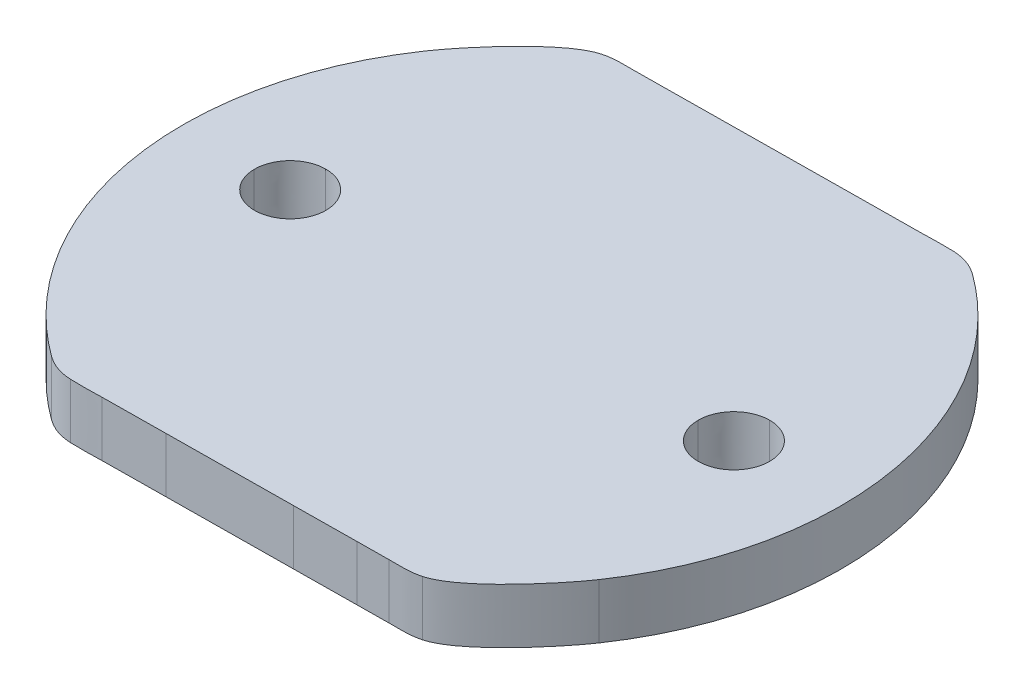
ISO-10303-21;
HEADER;
FILE_DESCRIPTION(('STEP AP214'),'2;1');
FILE_NAME('part.step','',(''),(''),'','','');
FILE_SCHEMA(('AUTOMOTIVE_DESIGN { 1 0 10303 214 1 1 1 1 }'));
ENDSEC;
DATA;
#1=APPLICATION_CONTEXT('core data for automotive mechanical design processes');
#2=APPLICATION_PROTOCOL_DEFINITION('international standard','automotive_design',2000,#1);
#3=PRODUCT_CONTEXT('',#1,'mechanical');
#4=PRODUCT('Part','Part','',(#3));
#5=PRODUCT_RELATED_PRODUCT_CATEGORY('part','',(#4));
#6=PRODUCT_DEFINITION_FORMATION('','',#4);
#7=PRODUCT_DEFINITION_CONTEXT('part definition',#1,'design');
#8=PRODUCT_DEFINITION('design','',#6,#7);
#9=PRODUCT_DEFINITION_SHAPE('','',#8);
#10=(LENGTH_UNIT() NAMED_UNIT(*) SI_UNIT(.MILLI.,.METRE.));
#11=(NAMED_UNIT(*) PLANE_ANGLE_UNIT() SI_UNIT($,.RADIAN.));
#12=(NAMED_UNIT(*) SI_UNIT($,.STERADIAN.) SOLID_ANGLE_UNIT());
#13=UNCERTAINTY_MEASURE_WITH_UNIT(LENGTH_MEASURE(1.E-05),#10,'distance_accuracy_value','');
#14=(GEOMETRIC_REPRESENTATION_CONTEXT(3) GLOBAL_UNCERTAINTY_ASSIGNED_CONTEXT((#13)) GLOBAL_UNIT_ASSIGNED_CONTEXT((#10,
#11,#12)) REPRESENTATION_CONTEXT('',''));
#15=CARTESIAN_POINT('',(0.,0.,0.));
#16=DIRECTION('',(0.,0.,1.));
#17=DIRECTION('',(1.,0.,0.));
#18=AXIS2_PLACEMENT_3D('',#15,#16,#17);
#19=CARTESIAN_POINT('',(59.2654263,6.35,-63.76567765));
#20=DIRECTION('',(0.,-1.,0.));
#21=DIRECTION('',(0.,0.,-1.));
#22=AXIS2_PLACEMENT_3D('',#19,#20,#21);
#23=PLANE('',#22);
#24=CARTESIAN_POINT('',(63.6829054,6.35,-36.5709454));
#25=CARTESIAN_POINT('',(61.4022394,6.35,-36.5409226));
#26=CARTESIAN_POINT('',(59.5694516,6.35,-34.6761308));
#27=CARTESIAN_POINT('',(59.5970106,6.35,-32.3954902));
#28=B_SPLINE_CURVE_WITH_KNOTS('',3,(#24,#25,#26,#27),.UNSPECIFIED.,.F.,.F.,(4,4),(0.,1.),.UNSPECIFIED.);
#29=CARTESIAN_POINT('',(63.6829054,6.35,-36.5709454));
#30=VERTEX_POINT('',#29);
#31=CARTESIAN_POINT('',(59.5970106,6.35,-32.3954902));
#32=VERTEX_POINT('',#31);
#33=EDGE_CURVE('E308',#30,#32,#28,.T.);
#34=ORIENTED_EDGE('',*,*,#33,.F.);
#35=CARTESIAN_POINT('',(67.8514772,6.35,-32.485076));
#36=CARTESIAN_POINT('',(67.830954,6.35,-34.7588332));
#37=CARTESIAN_POINT('',(65.963546,6.35,-36.591621));
#38=CARTESIAN_POINT('',(63.6829054,6.35,-36.5709454));
#39=B_SPLINE_CURVE_WITH_KNOTS('',3,(#35,#36,#37,#38),.UNSPECIFIED.,.F.,.F.,(4,4),(0.,1.),.UNSPECIFIED.);
#40=CARTESIAN_POINT('',(67.8514772,6.35,-32.485076));
#41=VERTEX_POINT('',#40);
#42=EDGE_CURVE('E266',#41,#30,#39,.T.);
#43=ORIENTED_EDGE('',*,*,#42,.F.);
#44=CARTESIAN_POINT('',(63.7655824,6.35,-28.3164788));
#45=CARTESIAN_POINT('',(66.046223,6.35,-28.336494));
#46=CARTESIAN_POINT('',(67.8721274,6.35,-30.2043846));
#47=CARTESIAN_POINT('',(67.8514772,6.35,-32.485076));
#48=B_SPLINE_CURVE_WITH_KNOTS('',3,(#44,#45,#46,#47),.UNSPECIFIED.,.F.,.F.,(4,4),(0.,1.),.UNSPECIFIED.);
#49=CARTESIAN_POINT('',(63.7655824,6.35,-28.3164788));
#50=VERTEX_POINT('',#49);
#51=EDGE_CURVE('E272',#50,#41,#48,.T.);
#52=ORIENTED_EDGE('',*,*,#51,.F.);
#53=CARTESIAN_POINT('',(59.5970106,6.35,-32.3954902));
#54=CARTESIAN_POINT('',(59.6175084,6.35,-30.121733));
#55=CARTESIAN_POINT('',(61.4849164,6.35,-28.2889452));
#56=CARTESIAN_POINT('',(63.7655824,6.35,-28.3164788));
#57=B_SPLINE_CURVE_WITH_KNOTS('',3,(#53,#54,#55,#56),.UNSPECIFIED.,.F.,.F.,(4,4),(0.,1.),.UNSPECIFIED.);
#58=EDGE_CURVE('E536',#32,#50,#57,.T.);
#59=ORIENTED_EDGE('',*,*,#58,.F.);
#60=EDGE_LOOP('',(#34,#43,#52,#59));
#61=FACE_BOUND('',#60,.T.);
#62=CARTESIAN_POINT('',(60.8717096,6.35,-62.8914922));
#63=CARTESIAN_POINT('',(59.8243914,6.35,-63.663195));
#64=CARTESIAN_POINT('',(58.7701898,6.35,-64.0421376));
#65=CARTESIAN_POINT('',(57.4679572,6.35,-64.1179312));
#66=B_SPLINE_CURVE_WITH_KNOTS('',3,(#62,#63,#64,#65),.UNSPECIFIED.,.F.,.F.,(4,4),(0.,1.),.UNSPECIFIED.);
#67=CARTESIAN_POINT('',(60.8717096,6.35,-62.8914922));
#68=VERTEX_POINT('',#67);
#69=CARTESIAN_POINT('',(57.4679572,6.35,-64.1179312));
#70=VERTEX_POINT('',#69);
#71=EDGE_CURVE('E321',#68,#70,#66,.T.);
#72=ORIENTED_EDGE('',*,*,#71,.T.);
#73=CARTESIAN_POINT('',(57.4679572,6.35,-64.1179312));
#74=CARTESIAN_POINT('',(56.2483762,6.35,-64.1799326));
#75=CARTESIAN_POINT('',(55.035704,6.35,-64.1029452));
#76=CARTESIAN_POINT('',(53.8230318,6.35,-64.0879338));
#77=B_SPLINE_CURVE_WITH_KNOTS('',3,(#73,#74,#75,#76),.UNSPECIFIED.,.F.,.F.,(4,4),(0.,1.),.UNSPECIFIED.);
#78=CARTESIAN_POINT('',(53.8230318,6.35,-64.0879338));
#79=VERTEX_POINT('',#78);
#80=EDGE_CURVE('E327',#70,#79,#77,.T.);
#81=ORIENTED_EDGE('',*,*,#80,.T.);
#82=CARTESIAN_POINT('',(53.8230318,6.35,-64.0879338));
#83=CARTESIAN_POINT('',(51.390804,6.35,-64.0629402));
#84=CARTESIAN_POINT('',(48.9585508,6.35,-64.0379212));
#85=CARTESIAN_POINT('',(46.526323,6.35,-64.018922));
#86=B_SPLINE_CURVE_WITH_KNOTS('',3,(#82,#83,#84,#85),.UNSPECIFIED.,.F.,.F.,(4,4),(0.,1.),.UNSPECIFIED.);
#87=CARTESIAN_POINT('',(46.526323,6.35,-64.018922));
#88=VERTEX_POINT('',#87);
#89=EDGE_CURVE('E336',#79,#88,#86,.T.);
#90=ORIENTED_EDGE('',*,*,#89,.T.);
#91=CARTESIAN_POINT('',(46.526323,6.35,-64.018922));
#92=CARTESIAN_POINT('',(41.661842,6.35,-63.963931));
#93=CARTESIAN_POINT('',(36.797361,6.35,-63.9154424));
#94=CARTESIAN_POINT('',(31.9329054,6.35,-63.8674364));
#95=B_SPLINE_CURVE_WITH_KNOTS('',3,(#91,#92,#93,#94),.UNSPECIFIED.,.F.,.F.,(4,4),(0.,1.),.UNSPECIFIED.);
#96=CARTESIAN_POINT('',(31.9329054,6.35,-63.8674364));
#97=VERTEX_POINT('',#96);
#98=EDGE_CURVE('E359',#88,#97,#95,.T.);
#99=ORIENTED_EDGE('',*,*,#98,.T.);
#100=CARTESIAN_POINT('',(31.9329054,6.35,-63.8674364));
#101=CARTESIAN_POINT('',(29.4937688,6.35,-63.837439));
#102=CARTESIAN_POINT('',(27.061541,6.35,-63.8174238));
#103=CARTESIAN_POINT('',(24.6292878,6.35,-63.7914396));
#104=B_SPLINE_CURVE_WITH_KNOTS('',3,(#100,#101,#102,#103),.UNSPECIFIED.,.F.,.F.,(4,4),(0.,1.),.UNSPECIFIED.);
#105=CARTESIAN_POINT('',(24.6292878,6.35,-63.7914396));
#106=VERTEX_POINT('',#105);
#107=EDGE_CURVE('E363',#97,#106,#104,.T.);
#108=ORIENTED_EDGE('',*,*,#107,.T.);
#109=CARTESIAN_POINT('',(24.6292878,6.35,-63.7914396));
#110=CARTESIAN_POINT('',(23.4097322,6.35,-63.7764282));
#111=CARTESIAN_POINT('',(22.19706,6.35,-63.7714244));
#112=CARTESIAN_POINT('',(20.9775044,6.35,-63.7564384));
#113=B_SPLINE_CURVE_WITH_KNOTS('',3,(#109,#110,#111,#112),.UNSPECIFIED.,.F.,.F.,(4,4),(0.,1.),.UNSPECIFIED.);
#114=CARTESIAN_POINT('',(20.9775044,6.35,-63.7564384));
#115=VERTEX_POINT('',#114);
#116=EDGE_CURVE('E371',#106,#115,#113,.T.);
#117=ORIENTED_EDGE('',*,*,#116,.T.);
#118=CARTESIAN_POINT('',(20.9775044,6.35,-63.7564384));
#119=CARTESIAN_POINT('',(19.7579234,6.35,-63.741427));
#120=CARTESIAN_POINT('',(18.5590434,6.35,-63.8389376));
#121=CARTESIAN_POINT('',(17.3463712,6.35,-63.5084328));
#122=B_SPLINE_CURVE_WITH_KNOTS('',3,(#118,#119,#120,#121),.UNSPECIFIED.,.F.,.F.,(4,4),(0.,1.),.UNSPECIFIED.);
#123=CARTESIAN_POINT('',(17.3463712,6.35,-63.5084328));
#124=VERTEX_POINT('',#123);
#125=EDGE_CURVE('E379',#115,#124,#122,.T.);
#126=ORIENTED_EDGE('',*,*,#125,.T.);
#127=CARTESIAN_POINT('',(17.3463712,6.35,-63.5084328));
#128=CARTESIAN_POINT('',(13.8599164,6.35,-62.5575838));
#129=CARTESIAN_POINT('',(8.5751416,6.35,-56.1841396));
#130=CARTESIAN_POINT('',(6.8250308,6.35,-53.6141422));
#131=B_SPLINE_CURVE_WITH_KNOTS('',3,(#127,#128,#129,#130),.UNSPECIFIED.,.F.,.F.,(4,4),(0.,1.),.UNSPECIFIED.);
#132=CARTESIAN_POINT('',(6.8250308,6.35,-53.6141422));
#133=VERTEX_POINT('',#132);
#134=EDGE_CURVE('E402',#124,#133,#131,.T.);
#135=ORIENTED_EDGE('',*,*,#134,.T.);
#136=CARTESIAN_POINT('',(6.8250308,6.35,-53.6141422));
#137=CARTESIAN_POINT('',(-4.716018,6.35,-36.6573308));
#138=CARTESIAN_POINT('',(-0.7610602,6.35,-13.6096756));
#139=CARTESIAN_POINT('',(15.7754066,6.35,-1.469136));
#140=B_SPLINE_CURVE_WITH_KNOTS('',3,(#136,#137,#138,#139),.UNSPECIFIED.,.F.,.F.,(4,4),(0.,1.),.UNSPECIFIED.);
#141=CARTESIAN_POINT('',(15.7754066,6.35,-1.469136));
#142=VERTEX_POINT('',#141);
#143=EDGE_CURVE('E406',#133,#142,#140,.T.);
#144=ORIENTED_EDGE('',*,*,#143,.T.);
#145=CARTESIAN_POINT('',(15.7754066,6.35,-1.469136));
#146=CARTESIAN_POINT('',(16.8296082,6.35,-0.6974332));
#147=CARTESIAN_POINT('',(17.876901,6.35,-0.3184906));
#148=CARTESIAN_POINT('',(19.1860424,6.35,-0.2495804));
#149=B_SPLINE_CURVE_WITH_KNOTS('',3,(#145,#146,#147,#148),.UNSPECIFIED.,.F.,.F.,(4,4),(0.,1.),.UNSPECIFIED.);
#150=CARTESIAN_POINT('',(19.1860424,6.35,-0.2495804));
#151=VERTEX_POINT('',#150);
#152=EDGE_CURVE('E414',#142,#151,#149,.T.);
#153=ORIENTED_EDGE('',*,*,#152,.T.);
#154=CARTESIAN_POINT('',(19.1860424,6.35,-0.2495804));
#155=CARTESIAN_POINT('',(20.3987146,6.35,-0.180594));
#156=CARTESIAN_POINT('',(21.6113868,6.35,-0.2545842));
#157=CARTESIAN_POINT('',(22.8309424,6.35,-0.2695956));
#158=B_SPLINE_CURVE_WITH_KNOTS('',3,(#154,#155,#156,#157),.UNSPECIFIED.,.F.,.F.,(4,4),(0.,1.),.UNSPECIFIED.);
#159=CARTESIAN_POINT('',(22.8309424,6.35,-0.2695956));
#160=VERTEX_POINT('',#159);
#161=EDGE_CURVE('E422',#151,#160,#158,.T.);
#162=ORIENTED_EDGE('',*,*,#161,.T.);
#163=CARTESIAN_POINT('',(22.8309424,6.35,-0.2695956));
#164=CARTESIAN_POINT('',(25.2563122,6.35,-0.2945892));
#165=CARTESIAN_POINT('',(27.6954234,6.35,-0.3195828));
#166=CARTESIAN_POINT('',(30.1276766,6.35,-0.3455924));
#167=B_SPLINE_CURVE_WITH_KNOTS('',3,(#163,#164,#165,#166),.UNSPECIFIED.,.F.,.F.,(4,4),(0.,1.),.UNSPECIFIED.);
#168=CARTESIAN_POINT('',(30.1276766,6.35,-0.3455924));
#169=VERTEX_POINT('',#168);
#170=EDGE_CURVE('E445',#160,#169,#167,.T.);
#171=ORIENTED_EDGE('',*,*,#170,.T.);
#172=CARTESIAN_POINT('',(30.1276766,6.35,-0.3455924));
#173=CARTESIAN_POINT('',(34.9921322,6.35,-0.3955796));
#174=CARTESIAN_POINT('',(39.8566132,6.35,-0.442087));
#175=CARTESIAN_POINT('',(44.7210942,6.35,-0.490093));
#176=B_SPLINE_CURVE_WITH_KNOTS('',3,(#172,#173,#174,#175),.UNSPECIFIED.,.F.,.F.,(4,4),(0.,1.),.UNSPECIFIED.);
#177=CARTESIAN_POINT('',(44.7210942,6.35,-0.490093));
#178=VERTEX_POINT('',#177);
#179=EDGE_CURVE('E449',#169,#178,#176,.T.);
#180=ORIENTED_EDGE('',*,*,#179,.T.);
#181=CARTESIAN_POINT('',(44.7210942,6.35,-0.490093));
#182=CARTESIAN_POINT('',(47.153322,6.35,-0.5200904));
#183=CARTESIAN_POINT('',(49.5855752,6.35,-0.5400802));
#184=CARTESIAN_POINT('',(52.0246864,6.35,-0.5660898));
#185=B_SPLINE_CURVE_WITH_KNOTS('',3,(#181,#182,#183,#184),.UNSPECIFIED.,.F.,.F.,(4,4),(0.,1.),.UNSPECIFIED.);
#186=CARTESIAN_POINT('',(52.0246864,6.35,-0.5660898));
#187=VERTEX_POINT('',#186);
#188=EDGE_CURVE('E457',#178,#187,#185,.T.);
#189=ORIENTED_EDGE('',*,*,#188,.T.);
#190=CARTESIAN_POINT('',(52.0246864,6.35,-0.5660898));
#191=CARTESIAN_POINT('',(53.2373586,6.35,-0.5810758));
#192=CARTESIAN_POINT('',(54.4569396,6.35,-0.5960872));
#193=CARTESIAN_POINT('',(55.6696118,6.35,-0.601091));
#194=B_SPLINE_CURVE_WITH_KNOTS('',3,(#190,#191,#192,#193),.UNSPECIFIED.,.F.,.F.,(4,4),(0.,1.),.UNSPECIFIED.);
#195=CARTESIAN_POINT('',(55.6696118,6.35,-0.601091));
#196=VERTEX_POINT('',#195);
#197=EDGE_CURVE('E465',#187,#196,#194,.T.);
#198=ORIENTED_EDGE('',*,*,#197,.T.);
#199=CARTESIAN_POINT('',(55.6696118,6.35,-0.601091));
#200=CARTESIAN_POINT('',(56.8891674,6.35,-0.616077));
#201=CARTESIAN_POINT('',(58.0880474,6.35,-0.5185918));
#202=CARTESIAN_POINT('',(59.3076284,6.35,-0.8490712));
#203=B_SPLINE_CURVE_WITH_KNOTS('',3,(#199,#200,#201,#202),.UNSPECIFIED.,.F.,.F.,(4,4),(0.,1.),.UNSPECIFIED.);
#204=CARTESIAN_POINT('',(59.3076284,6.35,-0.8490712));
#205=VERTEX_POINT('',#204);
#206=EDGE_CURVE('E488',#196,#205,#203,.T.);
#207=ORIENTED_EDGE('',*,*,#206,.T.);
#208=CARTESIAN_POINT('',(59.3076284,6.35,-0.8490712));
#209=CARTESIAN_POINT('',(62.7940578,6.35,-1.7999456));
#210=CARTESIAN_POINT('',(68.0788326,6.35,-8.1802732));
#211=CARTESIAN_POINT('',(69.8220346,6.35,-10.7433872));
#212=B_SPLINE_CURVE_WITH_KNOTS('',3,(#208,#209,#210,#211),.UNSPECIFIED.,.F.,.F.,(4,4),(0.,1.),.UNSPECIFIED.);
#213=CARTESIAN_POINT('',(69.8220346,6.35,-10.7433872));
#214=VERTEX_POINT('',#213);
#215=EDGE_CURVE('E492',#205,#214,#212,.T.);
#216=ORIENTED_EDGE('',*,*,#215,.T.);
#217=CARTESIAN_POINT('',(69.8220346,6.35,-10.7433872));
#218=CARTESIAN_POINT('',(81.3631088,6.35,-27.7001732));
#219=CARTESIAN_POINT('',(77.408151,6.35,-50.7478792));
#220=CARTESIAN_POINT('',(60.8717096,6.35,-62.8883934));
#221=B_SPLINE_CURVE_WITH_KNOTS('',3,(#217,#218,#219,#220),.UNSPECIFIED.,.F.,.F.,(4,4),(0.,1.),.UNSPECIFIED.);
#222=CARTESIAN_POINT('',(60.8717096,6.35,-62.8883934));
#223=VERTEX_POINT('',#222);
#224=EDGE_CURVE('E500',#214,#223,#221,.T.);
#225=ORIENTED_EDGE('',*,*,#224,.T.);
#226=DIRECTION('',(0.,0.,-1.));
#227=VECTOR('',#226,1.);
#228=CARTESIAN_POINT('',(60.8717096,6.35,-62.8883934));
#229=LINE('',#228,#227);
#230=EDGE_CURVE('E508',#223,#68,#229,.T.);
#231=ORIENTED_EDGE('',*,*,#230,.T.);
#232=EDGE_LOOP('',(#72,#81,#90,#99,#108,#117,#126,#135,#144,#153,#162,#171,#180,#189,#198,#207,
#216,#225,#231));
#233=FACE_BOUND('',#232,.T.);
#234=CARTESIAN_POINT('',(17.0569636,6.35,-31.9682876));
#235=CARTESIAN_POINT('',(17.0294046,6.35,-34.2489282));
#236=CARTESIAN_POINT('',(15.1621744,6.35,-36.0741722));
#237=CARTESIAN_POINT('',(12.8884172,6.35,-36.0541824));
#238=B_SPLINE_CURVE_WITH_KNOTS('',3,(#234,#235,#236,#237),.UNSPECIFIED.,.F.,.F.,(4,4),(0.,1.),.UNSPECIFIED.);
#239=CARTESIAN_POINT('',(17.0569636,6.35,-31.9682876));
#240=VERTEX_POINT('',#239);
#241=CARTESIAN_POINT('',(12.8884172,6.35,-36.0541824));
#242=VERTEX_POINT('',#241);
#243=EDGE_CURVE('E213',#240,#242,#238,.T.);
#244=ORIENTED_EDGE('',*,*,#243,.F.);
#245=CARTESIAN_POINT('',(12.9710942,6.35,-27.7997412));
#246=CARTESIAN_POINT('',(15.2448514,6.35,-27.8203914));
#247=CARTESIAN_POINT('',(17.0776138,6.35,-29.6876216));
#248=CARTESIAN_POINT('',(17.0569636,6.35,-31.9682876));
#249=B_SPLINE_CURVE_WITH_KNOTS('',3,(#245,#246,#247,#248),.UNSPECIFIED.,.F.,.F.,(4,4),(0.,1.),.UNSPECIFIED.);
#250=CARTESIAN_POINT('',(12.9710942,6.35,-27.7997412));
#251=VERTEX_POINT('',#250);
#252=EDGE_CURVE('E235',#251,#240,#249,.T.);
#253=ORIENTED_EDGE('',*,*,#252,.F.);
#254=CARTESIAN_POINT('',(8.8025224,6.35,-31.885636));
#255=CARTESIAN_POINT('',(8.823198,6.35,-29.6049954));
#256=CARTESIAN_POINT('',(10.6904282,6.35,-27.7747222));
#257=CARTESIAN_POINT('',(12.9710942,6.35,-27.7997412));
#258=B_SPLINE_CURVE_WITH_KNOTS('',3,(#254,#255,#256,#257),.UNSPECIFIED.,.F.,.F.,(4,4),(0.,1.),.UNSPECIFIED.);
#259=CARTESIAN_POINT('',(8.8025224,6.35,-31.885636));
#260=VERTEX_POINT('',#259);
#261=EDGE_CURVE('E233',#260,#251,#258,.T.);
#262=ORIENTED_EDGE('',*,*,#261,.F.);
#263=CARTESIAN_POINT('',(12.8884172,6.35,-36.0541824));
#264=CARTESIAN_POINT('',(10.6077512,6.35,-36.0266234));
#265=CARTESIAN_POINT('',(8.7749634,6.35,-34.1593932));
#266=CARTESIAN_POINT('',(8.8025224,6.35,-31.885636));
#267=B_SPLINE_CURVE_WITH_KNOTS('',3,(#263,#264,#265,#266),.UNSPECIFIED.,.F.,.F.,(4,4),(0.,1.),.UNSPECIFIED.);
#268=EDGE_CURVE('E221',#242,#260,#267,.T.);
#269=ORIENTED_EDGE('',*,*,#268,.F.);
#270=EDGE_LOOP('',(#244,#253,#262,#269));
#271=FACE_BOUND('',#270,.T.);
#272=ADVANCED_FACE('F33',(#61,#233,#271),#23,.F.);
#273=CARTESIAN_POINT('',(59.2654263,0.,-63.76567765));
#274=DIRECTION('',(0.,-1.,0.));
#275=DIRECTION('',(0.,0.,-1.));
#276=AXIS2_PLACEMENT_3D('',#273,#274,#275);
#277=PLANE('',#276);
#278=CARTESIAN_POINT('',(60.8717096,0.,-62.8914922));
#279=CARTESIAN_POINT('',(59.8243914,0.,-63.663195));
#280=CARTESIAN_POINT('',(58.7701898,0.,-64.0421376));
#281=CARTESIAN_POINT('',(57.4679572,0.,-64.1179312));
#282=B_SPLINE_CURVE_WITH_KNOTS('',3,(#278,#279,#280,#281),.UNSPECIFIED.,.F.,.F.,(4,4),(0.,1.),.UNSPECIFIED.);
#283=CARTESIAN_POINT('',(60.8717096,0.,-62.8914922));
#284=VERTEX_POINT('',#283);
#285=CARTESIAN_POINT('',(57.4679572,0.,-64.1179312));
#286=VERTEX_POINT('',#285);
#287=EDGE_CURVE('E320',#284,#286,#282,.T.);
#288=ORIENTED_EDGE('',*,*,#287,.F.);
#289=DIRECTION('',(0.,0.,-1.));
#290=VECTOR('',#289,1.);
#291=CARTESIAN_POINT('',(60.8717096,0.,-62.8883934));
#292=LINE('',#291,#290);
#293=CARTESIAN_POINT('',(60.8717096,0.,-62.8883934));
#294=VERTEX_POINT('',#293);
#295=EDGE_CURVE('E328',#294,#284,#292,.T.);
#296=ORIENTED_EDGE('',*,*,#295,.F.);
#297=CARTESIAN_POINT('',(69.8220346,0.,-10.7433872));
#298=CARTESIAN_POINT('',(81.3631088,0.,-27.7001732));
#299=CARTESIAN_POINT('',(77.408151,0.,-50.7478792));
#300=CARTESIAN_POINT('',(60.8717096,0.,-62.8883934));
#301=B_SPLINE_CURVE_WITH_KNOTS('',3,(#297,#298,#299,#300),.UNSPECIFIED.,.F.,.F.,(4,4),(0.,1.),.UNSPECIFIED.);
#302=CARTESIAN_POINT('',(69.8220346,0.,-10.7433872));
#303=VERTEX_POINT('',#302);
#304=EDGE_CURVE('E875',#303,#294,#301,.T.);
#305=ORIENTED_EDGE('',*,*,#304,.F.);
#306=CARTESIAN_POINT('',(59.3076284,0.,-0.8490712));
#307=CARTESIAN_POINT('',(62.7940578,0.,-1.7999456));
#308=CARTESIAN_POINT('',(68.0788326,0.,-8.1802732));
#309=CARTESIAN_POINT('',(69.8220346,0.,-10.7433872));
#310=B_SPLINE_CURVE_WITH_KNOTS('',3,(#306,#307,#308,#309),.UNSPECIFIED.,.F.,.F.,(4,4),(0.,1.),.UNSPECIFIED.);
#311=CARTESIAN_POINT('',(59.3076284,0.,-0.8490712));
#312=VERTEX_POINT('',#311);
#313=EDGE_CURVE('E868',#312,#303,#310,.T.);
#314=ORIENTED_EDGE('',*,*,#313,.F.);
#315=CARTESIAN_POINT('',(55.6696118,0.,-0.601091));
#316=CARTESIAN_POINT('',(56.8891674,0.,-0.616077));
#317=CARTESIAN_POINT('',(58.0880474,0.,-0.5185918));
#318=CARTESIAN_POINT('',(59.3076284,0.,-0.8490712));
#319=B_SPLINE_CURVE_WITH_KNOTS('',3,(#315,#316,#317,#318),.UNSPECIFIED.,.F.,.F.,(4,4),(0.,1.),.UNSPECIFIED.);
#320=CARTESIAN_POINT('',(55.6696118,0.,-0.601091));
#321=VERTEX_POINT('',#320);
#322=EDGE_CURVE('E861',#321,#312,#319,.T.);
#323=ORIENTED_EDGE('',*,*,#322,.F.);
#324=CARTESIAN_POINT('',(52.0246864,0.,-0.5660898));
#325=CARTESIAN_POINT('',(53.2373586,0.,-0.5810758));
#326=CARTESIAN_POINT('',(54.4569396,0.,-0.5960872));
#327=CARTESIAN_POINT('',(55.6696118,0.,-0.601091));
#328=B_SPLINE_CURVE_WITH_KNOTS('',3,(#324,#325,#326,#327),.UNSPECIFIED.,.F.,.F.,(4,4),(0.,1.),.UNSPECIFIED.);
#329=CARTESIAN_POINT('',(52.0246864,0.,-0.5660898));
#330=VERTEX_POINT('',#329);
#331=EDGE_CURVE('E854',#330,#321,#328,.T.);
#332=ORIENTED_EDGE('',*,*,#331,.F.);
#333=CARTESIAN_POINT('',(44.7210942,0.,-0.490093));
#334=CARTESIAN_POINT('',(47.153322,0.,-0.5200904));
#335=CARTESIAN_POINT('',(49.5855752,0.,-0.5400802));
#336=CARTESIAN_POINT('',(52.0246864,0.,-0.5660898));
#337=B_SPLINE_CURVE_WITH_KNOTS('',3,(#333,#334,#335,#336),.UNSPECIFIED.,.F.,.F.,(4,4),(0.,1.),.UNSPECIFIED.);
#338=CARTESIAN_POINT('',(44.7210942,0.,-0.490093));
#339=VERTEX_POINT('',#338);
#340=EDGE_CURVE('E847',#339,#330,#337,.T.);
#341=ORIENTED_EDGE('',*,*,#340,.F.);
#342=CARTESIAN_POINT('',(30.1276766,0.,-0.3455924));
#343=CARTESIAN_POINT('',(34.9921322,0.,-0.3955796));
#344=CARTESIAN_POINT('',(39.8566132,0.,-0.442087));
#345=CARTESIAN_POINT('',(44.7210942,0.,-0.490093));
#346=B_SPLINE_CURVE_WITH_KNOTS('',3,(#342,#343,#344,#345),.UNSPECIFIED.,.F.,.F.,(4,4),(0.,1.),.UNSPECIFIED.);
#347=CARTESIAN_POINT('',(30.1276766,0.,-0.3455924));
#348=VERTEX_POINT('',#347);
#349=EDGE_CURVE('E840',#348,#339,#346,.T.);
#350=ORIENTED_EDGE('',*,*,#349,.F.);
#351=CARTESIAN_POINT('',(22.8309424,0.,-0.2695956));
#352=CARTESIAN_POINT('',(25.2563122,0.,-0.2945892));
#353=CARTESIAN_POINT('',(27.6954234,0.,-0.3195828));
#354=CARTESIAN_POINT('',(30.1276766,0.,-0.3455924));
#355=B_SPLINE_CURVE_WITH_KNOTS('',3,(#351,#352,#353,#354),.UNSPECIFIED.,.F.,.F.,(4,4),(0.,1.),.UNSPECIFIED.);
#356=CARTESIAN_POINT('',(22.8309424,0.,-0.2695956));
#357=VERTEX_POINT('',#356);
#358=EDGE_CURVE('E833',#357,#348,#355,.T.);
#359=ORIENTED_EDGE('',*,*,#358,.F.);
#360=CARTESIAN_POINT('',(19.1860424,0.,-0.2495804));
#361=CARTESIAN_POINT('',(20.3987146,0.,-0.180594));
#362=CARTESIAN_POINT('',(21.6113868,0.,-0.2545842));
#363=CARTESIAN_POINT('',(22.8309424,0.,-0.2695956));
#364=B_SPLINE_CURVE_WITH_KNOTS('',3,(#360,#361,#362,#363),.UNSPECIFIED.,.F.,.F.,(4,4),(0.,1.),.UNSPECIFIED.);
#365=CARTESIAN_POINT('',(19.1860424,0.,-0.2495804));
#366=VERTEX_POINT('',#365);
#367=EDGE_CURVE('E826',#366,#357,#364,.T.);
#368=ORIENTED_EDGE('',*,*,#367,.F.);
#369=CARTESIAN_POINT('',(15.7754066,0.,-1.469136));
#370=CARTESIAN_POINT('',(16.8296082,0.,-0.6974332));
#371=CARTESIAN_POINT('',(17.876901,0.,-0.3184906));
#372=CARTESIAN_POINT('',(19.1860424,0.,-0.2495804));
#373=B_SPLINE_CURVE_WITH_KNOTS('',3,(#369,#370,#371,#372),.UNSPECIFIED.,.F.,.F.,(4,4),(0.,1.),.UNSPECIFIED.);
#374=CARTESIAN_POINT('',(15.7754066,0.,-1.469136));
#375=VERTEX_POINT('',#374);
#376=EDGE_CURVE('E819',#375,#366,#373,.T.);
#377=ORIENTED_EDGE('',*,*,#376,.F.);
#378=CARTESIAN_POINT('',(6.8250308,0.,-53.6141422));
#379=CARTESIAN_POINT('',(-4.716018,0.,-36.6573308));
#380=CARTESIAN_POINT('',(-0.7610602,0.,-13.6096756));
#381=CARTESIAN_POINT('',(15.7754066,0.,-1.469136));
#382=B_SPLINE_CURVE_WITH_KNOTS('',3,(#378,#379,#380,#381),.UNSPECIFIED.,.F.,.F.,(4,4),(0.,1.),.UNSPECIFIED.);
#383=CARTESIAN_POINT('',(6.8250308,0.,-53.6141422));
#384=VERTEX_POINT('',#383);
#385=EDGE_CURVE('E812',#384,#375,#382,.T.);
#386=ORIENTED_EDGE('',*,*,#385,.F.);
#387=CARTESIAN_POINT('',(17.3463712,0.,-63.5084328));
#388=CARTESIAN_POINT('',(13.8599164,0.,-62.5575838));
#389=CARTESIAN_POINT('',(8.5751416,0.,-56.1841396));
#390=CARTESIAN_POINT('',(6.8250308,0.,-53.6141422));
#391=B_SPLINE_CURVE_WITH_KNOTS('',3,(#387,#388,#389,#390),.UNSPECIFIED.,.F.,.F.,(4,4),(0.,1.),.UNSPECIFIED.);
#392=CARTESIAN_POINT('',(17.3463712,0.,-63.5084328));
#393=VERTEX_POINT('',#392);
#394=EDGE_CURVE('E805',#393,#384,#391,.T.);
#395=ORIENTED_EDGE('',*,*,#394,.F.);
#396=CARTESIAN_POINT('',(20.9775044,0.,-63.7564384));
#397=CARTESIAN_POINT('',(19.7579234,0.,-63.741427));
#398=CARTESIAN_POINT('',(18.5590434,0.,-63.8389376));
#399=CARTESIAN_POINT('',(17.3463712,0.,-63.5084328));
#400=B_SPLINE_CURVE_WITH_KNOTS('',3,(#396,#397,#398,#399),.UNSPECIFIED.,.F.,.F.,(4,4),(0.,1.),.UNSPECIFIED.);
#401=CARTESIAN_POINT('',(20.9775044,0.,-63.7564384));
#402=VERTEX_POINT('',#401);
#403=EDGE_CURVE('E798',#402,#393,#400,.T.);
#404=ORIENTED_EDGE('',*,*,#403,.F.);
#405=CARTESIAN_POINT('',(24.6292878,0.,-63.7914396));
#406=CARTESIAN_POINT('',(23.4097322,0.,-63.7764282));
#407=CARTESIAN_POINT('',(22.19706,0.,-63.7714244));
#408=CARTESIAN_POINT('',(20.9775044,0.,-63.7564384));
#409=B_SPLINE_CURVE_WITH_KNOTS('',3,(#405,#406,#407,#408),.UNSPECIFIED.,.F.,.F.,(4,4),(0.,1.),.UNSPECIFIED.);
#410=CARTESIAN_POINT('',(24.6292878,0.,-63.7914396));
#411=VERTEX_POINT('',#410);
#412=EDGE_CURVE('E791',#411,#402,#409,.T.);
#413=ORIENTED_EDGE('',*,*,#412,.F.);
#414=CARTESIAN_POINT('',(31.9329054,0.,-63.8674364));
#415=CARTESIAN_POINT('',(29.4937688,0.,-63.837439));
#416=CARTESIAN_POINT('',(27.061541,0.,-63.8174238));
#417=CARTESIAN_POINT('',(24.6292878,0.,-63.7914396));
#418=B_SPLINE_CURVE_WITH_KNOTS('',3,(#414,#415,#416,#417),.UNSPECIFIED.,.F.,.F.,(4,4),(0.,1.),.UNSPECIFIED.);
#419=CARTESIAN_POINT('',(31.9329054,0.,-63.8674364));
#420=VERTEX_POINT('',#419);
#421=EDGE_CURVE('E784',#420,#411,#418,.T.);
#422=ORIENTED_EDGE('',*,*,#421,.F.);
#423=CARTESIAN_POINT('',(46.526323,0.,-64.018922));
#424=CARTESIAN_POINT('',(41.661842,0.,-63.963931));
#425=CARTESIAN_POINT('',(36.797361,0.,-63.9154424));
#426=CARTESIAN_POINT('',(31.9329054,0.,-63.8674364));
#427=B_SPLINE_CURVE_WITH_KNOTS('',3,(#423,#424,#425,#426),.UNSPECIFIED.,.F.,.F.,(4,4),(0.,1.),.UNSPECIFIED.);
#428=CARTESIAN_POINT('',(46.526323,0.,-64.018922));
#429=VERTEX_POINT('',#428);
#430=EDGE_CURVE('E777',#429,#420,#427,.T.);
#431=ORIENTED_EDGE('',*,*,#430,.F.);
#432=CARTESIAN_POINT('',(53.8230318,0.,-64.0879338));
#433=CARTESIAN_POINT('',(51.390804,0.,-64.0629402));
#434=CARTESIAN_POINT('',(48.9585508,0.,-64.0379212));
#435=CARTESIAN_POINT('',(46.526323,0.,-64.018922));
#436=B_SPLINE_CURVE_WITH_KNOTS('',3,(#432,#433,#434,#435),.UNSPECIFIED.,.F.,.F.,(4,4),(0.,1.),.UNSPECIFIED.);
#437=CARTESIAN_POINT('',(53.8230318,0.,-64.0879338));
#438=VERTEX_POINT('',#437);
#439=EDGE_CURVE('E761',#438,#429,#436,.T.);
#440=ORIENTED_EDGE('',*,*,#439,.F.);
#441=CARTESIAN_POINT('',(57.4679572,0.,-64.1179312));
#442=CARTESIAN_POINT('',(56.2483762,0.,-64.1799326));
#443=CARTESIAN_POINT('',(55.035704,0.,-64.1029452));
#444=CARTESIAN_POINT('',(53.8230318,0.,-64.0879338));
#445=B_SPLINE_CURVE_WITH_KNOTS('',3,(#441,#442,#443,#444),.UNSPECIFIED.,.F.,.F.,(4,4),(0.,1.),.UNSPECIFIED.);
#446=EDGE_CURVE('E760',#286,#438,#445,.T.);
#447=ORIENTED_EDGE('',*,*,#446,.F.);
#448=EDGE_LOOP('',(#288,#296,#305,#314,#323,#332,#341,#350,#359,#368,#377,#386,#395,#404,#413,
#422,#431,#440,#447));
#449=FACE_BOUND('',#448,.T.);
#450=CARTESIAN_POINT('',(67.8514772,0.,-32.485076));
#451=CARTESIAN_POINT('',(67.830954,0.,-34.7588332));
#452=CARTESIAN_POINT('',(65.963546,0.,-36.591621));
#453=CARTESIAN_POINT('',(63.6829054,0.,-36.5709454));
#454=B_SPLINE_CURVE_WITH_KNOTS('',3,(#450,#451,#452,#453),.UNSPECIFIED.,.F.,.F.,(4,4),(0.,1.),.UNSPECIFIED.);
#455=CARTESIAN_POINT('',(67.8514772,0.,-32.485076));
#456=VERTEX_POINT('',#455);
#457=CARTESIAN_POINT('',(63.6829054,0.,-36.5709454));
#458=VERTEX_POINT('',#457);
#459=EDGE_CURVE('E300',#456,#458,#454,.T.);
#460=ORIENTED_EDGE('',*,*,#459,.T.);
#461=CARTESIAN_POINT('',(63.6829054,0.,-36.5709454));
#462=CARTESIAN_POINT('',(61.4022394,0.,-36.5409226));
#463=CARTESIAN_POINT('',(59.5694516,0.,-34.6761308));
#464=CARTESIAN_POINT('',(59.5970106,0.,-32.3954902));
#465=B_SPLINE_CURVE_WITH_KNOTS('',3,(#461,#462,#463,#464),.UNSPECIFIED.,.F.,.F.,(4,4),(0.,1.),.UNSPECIFIED.);
#466=CARTESIAN_POINT('',(59.5970106,0.,-32.3954902));
#467=VERTEX_POINT('',#466);
#468=EDGE_CURVE('E229',#458,#467,#465,.T.);
#469=ORIENTED_EDGE('',*,*,#468,.T.);
#470=CARTESIAN_POINT('',(59.5970106,0.,-32.3954902));
#471=CARTESIAN_POINT('',(59.6175084,0.,-30.121733));
#472=CARTESIAN_POINT('',(61.4849164,0.,-28.2889452));
#473=CARTESIAN_POINT('',(63.7655824,0.,-28.3164788));
#474=B_SPLINE_CURVE_WITH_KNOTS('',3,(#470,#471,#472,#473),.UNSPECIFIED.,.F.,.F.,(4,4),(0.,1.),.UNSPECIFIED.);
#475=CARTESIAN_POINT('',(63.7655824,0.,-28.3164788));
#476=VERTEX_POINT('',#475);
#477=EDGE_CURVE('E284',#467,#476,#474,.T.);
#478=ORIENTED_EDGE('',*,*,#477,.T.);
#479=CARTESIAN_POINT('',(63.7655824,0.,-28.3164788));
#480=CARTESIAN_POINT('',(66.046223,0.,-28.336494));
#481=CARTESIAN_POINT('',(67.8721274,0.,-30.2043846));
#482=CARTESIAN_POINT('',(67.8514772,0.,-32.485076));
#483=B_SPLINE_CURVE_WITH_KNOTS('',3,(#479,#480,#481,#482),.UNSPECIFIED.,.F.,.F.,(4,4),(0.,1.),.UNSPECIFIED.);
#484=EDGE_CURVE('E292',#476,#456,#483,.T.);
#485=ORIENTED_EDGE('',*,*,#484,.T.);
#486=EDGE_LOOP('',(#460,#469,#478,#485));
#487=FACE_BOUND('',#486,.T.);
#488=CARTESIAN_POINT('',(12.9710942,0.,-27.7997412));
#489=CARTESIAN_POINT('',(15.2448514,0.,-27.8203914));
#490=CARTESIAN_POINT('',(17.0776138,0.,-29.6876216));
#491=CARTESIAN_POINT('',(17.0569636,0.,-31.9682876));
#492=B_SPLINE_CURVE_WITH_KNOTS('',3,(#488,#489,#490,#491),.UNSPECIFIED.,.F.,.F.,(4,4),(0.,1.),.UNSPECIFIED.);
#493=CARTESIAN_POINT('',(12.9710942,0.,-27.7997412));
#494=VERTEX_POINT('',#493);
#495=CARTESIAN_POINT('',(17.0569636,0.,-31.9682876));
#496=VERTEX_POINT('',#495);
#497=EDGE_CURVE('E222',#494,#496,#492,.T.);
#498=ORIENTED_EDGE('',*,*,#497,.T.);
#499=CARTESIAN_POINT('',(17.0569636,0.,-31.9682876));
#500=CARTESIAN_POINT('',(17.0294046,0.,-34.2489282));
#501=CARTESIAN_POINT('',(15.1621744,0.,-36.0741722));
#502=CARTESIAN_POINT('',(12.8884172,0.,-36.0541824));
#503=B_SPLINE_CURVE_WITH_KNOTS('',3,(#499,#500,#501,#502),.UNSPECIFIED.,.F.,.F.,(4,4),(0.,1.),.UNSPECIFIED.);
#504=CARTESIAN_POINT('',(12.8884172,0.,-36.0541824));
#505=VERTEX_POINT('',#504);
#506=EDGE_CURVE('E57',#496,#505,#503,.T.);
#507=ORIENTED_EDGE('',*,*,#506,.T.);
#508=CARTESIAN_POINT('',(12.8884172,0.,-36.0541824));
#509=CARTESIAN_POINT('',(10.6077512,0.,-36.0266234));
#510=CARTESIAN_POINT('',(8.7749634,0.,-34.1593932));
#511=CARTESIAN_POINT('',(8.8025224,0.,-31.885636));
#512=B_SPLINE_CURVE_WITH_KNOTS('',3,(#508,#509,#510,#511),.UNSPECIFIED.,.F.,.F.,(4,4),(0.,1.),.UNSPECIFIED.);
#513=CARTESIAN_POINT('',(8.8025224,0.,-31.885636));
#514=VERTEX_POINT('',#513);
#515=EDGE_CURVE('E228',#505,#514,#512,.T.);
#516=ORIENTED_EDGE('',*,*,#515,.T.);
#517=CARTESIAN_POINT('',(8.8025224,0.,-31.885636));
#518=CARTESIAN_POINT('',(8.823198,0.,-29.6049954));
#519=CARTESIAN_POINT('',(10.6904282,0.,-27.7747222));
#520=CARTESIAN_POINT('',(12.9710942,0.,-27.7997412));
#521=B_SPLINE_CURVE_WITH_KNOTS('',3,(#517,#518,#519,#520),.UNSPECIFIED.,.F.,.F.,(4,4),(0.,1.),.UNSPECIFIED.);
#522=EDGE_CURVE('E1001',#514,#494,#521,.T.);
#523=ORIENTED_EDGE('',*,*,#522,.T.);
#524=EDGE_LOOP('',(#498,#507,#516,#523));
#525=FACE_BOUND('',#524,.T.);
#526=ADVANCED_FACE('F522',(#449,#487,#525),#277,.T.);
#527=DIRECTION('',(0.,-1.,0.));
#528=VECTOR('',#527,1.);
#529=SURFACE_OF_LINEAR_EXTRUSION('',#66,#528);
#530=ORIENTED_EDGE('',*,*,#287,.T.);
#531=DIRECTION('',(0.,-1.,0.));
#532=VECTOR('',#531,1.);
#533=CARTESIAN_POINT('',(57.4679572,6.35,-64.1179312));
#534=LINE('',#533,#532);
#535=EDGE_CURVE('E11',#70,#286,#534,.T.);
#536=ORIENTED_EDGE('',*,*,#535,.F.);
#537=ORIENTED_EDGE('',*,*,#71,.F.);
#538=DIRECTION('',(0.,-1.,0.));
#539=VECTOR('',#538,1.);
#540=CARTESIAN_POINT('',(60.8717096,6.35,-62.8914922));
#541=LINE('',#540,#539);
#542=EDGE_CURVE('E758',#68,#284,#541,.T.);
#543=ORIENTED_EDGE('',*,*,#542,.T.);
#544=EDGE_LOOP('',(#530,#536,#537,#543));
#545=FACE_BOUND('',#544,.T.);
#546=ADVANCED_FACE('F35',(#545),#529,.F.);
#547=DIRECTION('',(0.,-1.,0.));
#548=VECTOR('',#547,1.);
#549=SURFACE_OF_LINEAR_EXTRUSION('',#77,#548);
#550=ORIENTED_EDGE('',*,*,#446,.T.);
#551=DIRECTION('',(0.,-1.,0.));
#552=VECTOR('',#551,1.);
#553=CARTESIAN_POINT('',(53.8230318,6.35,-64.0879338));
#554=LINE('',#553,#552);
#555=EDGE_CURVE('E42',#79,#438,#554,.T.);
#556=ORIENTED_EDGE('',*,*,#555,.F.);
#557=ORIENTED_EDGE('',*,*,#80,.F.);
#558=ORIENTED_EDGE('',*,*,#535,.T.);
#559=EDGE_LOOP('',(#550,#556,#557,#558));
#560=FACE_BOUND('',#559,.T.);
#561=ADVANCED_FACE('F344',(#560),#549,.F.);
#562=DIRECTION('',(0.,-1.,0.));
#563=VECTOR('',#562,1.);
#564=SURFACE_OF_LINEAR_EXTRUSION('',#86,#563);
#565=ORIENTED_EDGE('',*,*,#439,.T.);
#566=DIRECTION('',(0.,-1.,0.));
#567=VECTOR('',#566,1.);
#568=CARTESIAN_POINT('',(46.526323,6.35,-64.018922));
#569=LINE('',#568,#567);
#570=EDGE_CURVE('E932',#88,#429,#569,.T.);
#571=ORIENTED_EDGE('',*,*,#570,.F.);
#572=ORIENTED_EDGE('',*,*,#89,.F.);
#573=ORIENTED_EDGE('',*,*,#555,.T.);
#574=EDGE_LOOP('',(#565,#571,#572,#573));
#575=FACE_BOUND('',#574,.T.);
#576=ADVANCED_FACE('F347',(#575),#564,.F.);
#577=DIRECTION('',(0.,-1.,0.));
#578=VECTOR('',#577,1.);
#579=SURFACE_OF_LINEAR_EXTRUSION('',#95,#578);
#580=ORIENTED_EDGE('',*,*,#430,.T.);
#581=DIRECTION('',(0.,-1.,0.));
#582=VECTOR('',#581,1.);
#583=CARTESIAN_POINT('',(31.9329054,6.35,-63.8674364));
#584=LINE('',#583,#582);
#585=EDGE_CURVE('E929',#97,#420,#584,.T.);
#586=ORIENTED_EDGE('',*,*,#585,.F.);
#587=ORIENTED_EDGE('',*,*,#98,.F.);
#588=ORIENTED_EDGE('',*,*,#570,.T.);
#589=EDGE_LOOP('',(#580,#586,#587,#588));
#590=FACE_BOUND('',#589,.T.);
#591=ADVANCED_FACE('F351',(#590),#579,.F.);
#592=DIRECTION('',(0.,-1.,0.));
#593=VECTOR('',#592,1.);
#594=SURFACE_OF_LINEAR_EXTRUSION('',#104,#593);
#595=ORIENTED_EDGE('',*,*,#421,.T.);
#596=DIRECTION('',(0.,-1.,0.));
#597=VECTOR('',#596,1.);
#598=CARTESIAN_POINT('',(24.6292878,6.35,-63.7914396));
#599=LINE('',#598,#597);
#600=EDGE_CURVE('E926',#106,#411,#599,.T.);
#601=ORIENTED_EDGE('',*,*,#600,.F.);
#602=ORIENTED_EDGE('',*,*,#107,.F.);
#603=ORIENTED_EDGE('',*,*,#585,.T.);
#604=EDGE_LOOP('',(#595,#601,#602,#603));
#605=FACE_BOUND('',#604,.T.);
#606=ADVANCED_FACE('F355',(#605),#594,.F.);
#607=DIRECTION('',(0.,-1.,0.));
#608=VECTOR('',#607,1.);
#609=SURFACE_OF_LINEAR_EXTRUSION('',#113,#608);
#610=ORIENTED_EDGE('',*,*,#412,.T.);
#611=DIRECTION('',(0.,-1.,0.));
#612=VECTOR('',#611,1.);
#613=CARTESIAN_POINT('',(20.9775044,6.35,-63.7564384));
#614=LINE('',#613,#612);
#615=EDGE_CURVE('E923',#115,#402,#614,.T.);
#616=ORIENTED_EDGE('',*,*,#615,.F.);
#617=ORIENTED_EDGE('',*,*,#116,.F.);
#618=ORIENTED_EDGE('',*,*,#600,.T.);
#619=EDGE_LOOP('',(#610,#616,#617,#618));
#620=FACE_BOUND('',#619,.T.);
#621=ADVANCED_FACE('F387',(#620),#609,.F.);
#622=DIRECTION('',(0.,-1.,0.));
#623=VECTOR('',#622,1.);
#624=SURFACE_OF_LINEAR_EXTRUSION('',#122,#623);
#625=ORIENTED_EDGE('',*,*,#403,.T.);
#626=DIRECTION('',(0.,-1.,0.));
#627=VECTOR('',#626,1.);
#628=CARTESIAN_POINT('',(17.3463712,6.35,-63.5084328));
#629=LINE('',#628,#627);
#630=EDGE_CURVE('E920',#124,#393,#629,.T.);
#631=ORIENTED_EDGE('',*,*,#630,.F.);
#632=ORIENTED_EDGE('',*,*,#125,.F.);
#633=ORIENTED_EDGE('',*,*,#615,.T.);
#634=EDGE_LOOP('',(#625,#631,#632,#633));
#635=FACE_BOUND('',#634,.T.);
#636=ADVANCED_FACE('F390',(#635),#624,.F.);
#637=DIRECTION('',(0.,-1.,0.));
#638=VECTOR('',#637,1.);
#639=SURFACE_OF_LINEAR_EXTRUSION('',#131,#638);
#640=ORIENTED_EDGE('',*,*,#394,.T.);
#641=DIRECTION('',(0.,-1.,0.));
#642=VECTOR('',#641,1.);
#643=CARTESIAN_POINT('',(6.8250308,6.35,-53.6141422));
#644=LINE('',#643,#642);
#645=EDGE_CURVE('E917',#133,#384,#644,.T.);
#646=ORIENTED_EDGE('',*,*,#645,.F.);
#647=ORIENTED_EDGE('',*,*,#134,.F.);
#648=ORIENTED_EDGE('',*,*,#630,.T.);
#649=EDGE_LOOP('',(#640,#646,#647,#648));
#650=FACE_BOUND('',#649,.T.);
#651=ADVANCED_FACE('F394',(#650),#639,.F.);
#652=DIRECTION('',(0.,-1.,0.));
#653=VECTOR('',#652,1.);
#654=SURFACE_OF_LINEAR_EXTRUSION('',#140,#653);
#655=ORIENTED_EDGE('',*,*,#385,.T.);
#656=DIRECTION('',(0.,-1.,0.));
#657=VECTOR('',#656,1.);
#658=CARTESIAN_POINT('',(15.7754066,6.35,-1.469136));
#659=LINE('',#658,#657);
#660=EDGE_CURVE('E914',#142,#375,#659,.T.);
#661=ORIENTED_EDGE('',*,*,#660,.F.);
#662=ORIENTED_EDGE('',*,*,#143,.F.);
#663=ORIENTED_EDGE('',*,*,#645,.T.);
#664=EDGE_LOOP('',(#655,#661,#662,#663));
#665=FACE_BOUND('',#664,.T.);
#666=ADVANCED_FACE('F398',(#665),#654,.F.);
#667=DIRECTION('',(0.,-1.,0.));
#668=VECTOR('',#667,1.);
#669=SURFACE_OF_LINEAR_EXTRUSION('',#149,#668);
#670=ORIENTED_EDGE('',*,*,#376,.T.);
#671=DIRECTION('',(0.,-1.,0.));
#672=VECTOR('',#671,1.);
#673=CARTESIAN_POINT('',(19.1860424,6.35,-0.2495804));
#674=LINE('',#673,#672);
#675=EDGE_CURVE('E911',#151,#366,#674,.T.);
#676=ORIENTED_EDGE('',*,*,#675,.F.);
#677=ORIENTED_EDGE('',*,*,#152,.F.);
#678=ORIENTED_EDGE('',*,*,#660,.T.);
#679=EDGE_LOOP('',(#670,#676,#677,#678));
#680=FACE_BOUND('',#679,.T.);
#681=ADVANCED_FACE('F430',(#680),#669,.F.);
#682=DIRECTION('',(0.,-1.,0.));
#683=VECTOR('',#682,1.);
#684=SURFACE_OF_LINEAR_EXTRUSION('',#158,#683);
#685=ORIENTED_EDGE('',*,*,#367,.T.);
#686=DIRECTION('',(0.,-1.,0.));
#687=VECTOR('',#686,1.);
#688=CARTESIAN_POINT('',(22.8309424,6.35,-0.2695956));
#689=LINE('',#688,#687);
#690=EDGE_CURVE('E908',#160,#357,#689,.T.);
#691=ORIENTED_EDGE('',*,*,#690,.F.);
#692=ORIENTED_EDGE('',*,*,#161,.F.);
#693=ORIENTED_EDGE('',*,*,#675,.T.);
#694=EDGE_LOOP('',(#685,#691,#692,#693));
#695=FACE_BOUND('',#694,.T.);
#696=ADVANCED_FACE('F433',(#695),#684,.F.);
#697=DIRECTION('',(0.,-1.,0.));
#698=VECTOR('',#697,1.);
#699=SURFACE_OF_LINEAR_EXTRUSION('',#167,#698);
#700=ORIENTED_EDGE('',*,*,#358,.T.);
#701=DIRECTION('',(0.,-1.,0.));
#702=VECTOR('',#701,1.);
#703=CARTESIAN_POINT('',(30.1276766,6.35,-0.3455924));
#704=LINE('',#703,#702);
#705=EDGE_CURVE('E905',#169,#348,#704,.T.);
#706=ORIENTED_EDGE('',*,*,#705,.F.);
#707=ORIENTED_EDGE('',*,*,#170,.F.);
#708=ORIENTED_EDGE('',*,*,#690,.T.);
#709=EDGE_LOOP('',(#700,#706,#707,#708));
#710=FACE_BOUND('',#709,.T.);
#711=ADVANCED_FACE('F437',(#710),#699,.F.);
#712=DIRECTION('',(0.,-1.,0.));
#713=VECTOR('',#712,1.);
#714=SURFACE_OF_LINEAR_EXTRUSION('',#176,#713);
#715=ORIENTED_EDGE('',*,*,#349,.T.);
#716=DIRECTION('',(0.,-1.,0.));
#717=VECTOR('',#716,1.);
#718=CARTESIAN_POINT('',(44.7210942,6.35,-0.490093));
#719=LINE('',#718,#717);
#720=EDGE_CURVE('E902',#178,#339,#719,.T.);
#721=ORIENTED_EDGE('',*,*,#720,.F.);
#722=ORIENTED_EDGE('',*,*,#179,.F.);
#723=ORIENTED_EDGE('',*,*,#705,.T.);
#724=EDGE_LOOP('',(#715,#721,#722,#723));
#725=FACE_BOUND('',#724,.T.);
#726=ADVANCED_FACE('F441',(#725),#714,.F.);
#727=DIRECTION('',(0.,-1.,0.));
#728=VECTOR('',#727,1.);
#729=SURFACE_OF_LINEAR_EXTRUSION('',#185,#728);
#730=ORIENTED_EDGE('',*,*,#340,.T.);
#731=DIRECTION('',(0.,-1.,0.));
#732=VECTOR('',#731,1.);
#733=CARTESIAN_POINT('',(52.0246864,6.35,-0.5660898));
#734=LINE('',#733,#732);
#735=EDGE_CURVE('E899',#187,#330,#734,.T.);
#736=ORIENTED_EDGE('',*,*,#735,.F.);
#737=ORIENTED_EDGE('',*,*,#188,.F.);
#738=ORIENTED_EDGE('',*,*,#720,.T.);
#739=EDGE_LOOP('',(#730,#736,#737,#738));
#740=FACE_BOUND('',#739,.T.);
#741=ADVANCED_FACE('F473',(#740),#729,.F.);
#742=DIRECTION('',(0.,-1.,0.));
#743=VECTOR('',#742,1.);
#744=SURFACE_OF_LINEAR_EXTRUSION('',#194,#743);
#745=ORIENTED_EDGE('',*,*,#331,.T.);
#746=DIRECTION('',(0.,-1.,0.));
#747=VECTOR('',#746,1.);
#748=CARTESIAN_POINT('',(55.6696118,6.35,-0.601091));
#749=LINE('',#748,#747);
#750=EDGE_CURVE('E896',#196,#321,#749,.T.);
#751=ORIENTED_EDGE('',*,*,#750,.F.);
#752=ORIENTED_EDGE('',*,*,#197,.F.);
#753=ORIENTED_EDGE('',*,*,#735,.T.);
#754=EDGE_LOOP('',(#745,#751,#752,#753));
#755=FACE_BOUND('',#754,.T.);
#756=ADVANCED_FACE('F476',(#755),#744,.F.);
#757=DIRECTION('',(0.,-1.,0.));
#758=VECTOR('',#757,1.);
#759=SURFACE_OF_LINEAR_EXTRUSION('',#203,#758);
#760=ORIENTED_EDGE('',*,*,#322,.T.);
#761=DIRECTION('',(0.,-1.,0.));
#762=VECTOR('',#761,1.);
#763=CARTESIAN_POINT('',(59.3076284,6.35,-0.8490712));
#764=LINE('',#763,#762);
#765=EDGE_CURVE('E893',#205,#312,#764,.T.);
#766=ORIENTED_EDGE('',*,*,#765,.F.);
#767=ORIENTED_EDGE('',*,*,#206,.F.);
#768=ORIENTED_EDGE('',*,*,#750,.T.);
#769=EDGE_LOOP('',(#760,#766,#767,#768));
#770=FACE_BOUND('',#769,.T.);
#771=ADVANCED_FACE('F480',(#770),#759,.F.);
#772=DIRECTION('',(0.,-1.,0.));
#773=VECTOR('',#772,1.);
#774=SURFACE_OF_LINEAR_EXTRUSION('',#212,#773);
#775=ORIENTED_EDGE('',*,*,#313,.T.);
#776=DIRECTION('',(0.,-1.,0.));
#777=VECTOR('',#776,1.);
#778=CARTESIAN_POINT('',(69.8220346,6.35,-10.7433872));
#779=LINE('',#778,#777);
#780=EDGE_CURVE('E890',#214,#303,#779,.T.);
#781=ORIENTED_EDGE('',*,*,#780,.F.);
#782=ORIENTED_EDGE('',*,*,#215,.F.);
#783=ORIENTED_EDGE('',*,*,#765,.T.);
#784=EDGE_LOOP('',(#775,#781,#782,#783));
#785=FACE_BOUND('',#784,.T.);
#786=ADVANCED_FACE('F484',(#785),#774,.F.);
#787=DIRECTION('',(0.,-1.,0.));
#788=VECTOR('',#787,1.);
#789=SURFACE_OF_LINEAR_EXTRUSION('',#221,#788);
#790=ORIENTED_EDGE('',*,*,#304,.T.);
#791=DIRECTION('',(0.,-1.,0.));
#792=VECTOR('',#791,1.);
#793=CARTESIAN_POINT('',(60.8717096,6.35,-62.8883934));
#794=LINE('',#793,#792);
#795=EDGE_CURVE('E887',#223,#294,#794,.T.);
#796=ORIENTED_EDGE('',*,*,#795,.F.);
#797=ORIENTED_EDGE('',*,*,#224,.F.);
#798=ORIENTED_EDGE('',*,*,#780,.T.);
#799=EDGE_LOOP('',(#790,#796,#797,#798));
#800=FACE_BOUND('',#799,.T.);
#801=ADVANCED_FACE('F513',(#800),#789,.F.);
#802=CARTESIAN_POINT('',(60.8717096,6.35,-62.8883934));
#803=DIRECTION('',(-1.,0.,0.));
#804=DIRECTION('',(0.,0.,1.));
#805=AXIS2_PLACEMENT_3D('',#802,#803,#804);
#806=PLANE('',#805);
#807=ORIENTED_EDGE('',*,*,#295,.T.);
#808=ORIENTED_EDGE('',*,*,#542,.F.);
#809=ORIENTED_EDGE('',*,*,#230,.F.);
#810=ORIENTED_EDGE('',*,*,#795,.T.);
#811=EDGE_LOOP('',(#807,#808,#809,#810));
#812=FACE_BOUND('',#811,.T.);
#813=ADVANCED_FACE('F516',(#812),#806,.F.);
#814=DIRECTION('',(0.,-1.,0.));
#815=VECTOR('',#814,1.);
#816=SURFACE_OF_LINEAR_EXTRUSION('',#28,#815);
#817=ORIENTED_EDGE('',*,*,#468,.F.);
#818=DIRECTION('',(0.,-1.,0.));
#819=VECTOR('',#818,1.);
#820=CARTESIAN_POINT('',(63.6829054,6.35,-36.5709454));
#821=LINE('',#820,#819);
#822=EDGE_CURVE('E271',#30,#458,#821,.T.);
#823=ORIENTED_EDGE('',*,*,#822,.F.);
#824=ORIENTED_EDGE('',*,*,#33,.T.);
#825=DIRECTION('',(0.,-1.,0.));
#826=VECTOR('',#825,1.);
#827=CARTESIAN_POINT('',(59.5970106,6.35,-32.3954902));
#828=LINE('',#827,#826);
#829=EDGE_CURVE('E318',#32,#467,#828,.T.);
#830=ORIENTED_EDGE('',*,*,#829,.T.);
#831=EDGE_LOOP('',(#817,#823,#824,#830));
#832=FACE_BOUND('',#831,.T.);
#833=ADVANCED_FACE('F520',(#832),#816,.T.);
#834=DIRECTION('',(0.,-1.,0.));
#835=VECTOR('',#834,1.);
#836=SURFACE_OF_LINEAR_EXTRUSION('',#57,#835);
#837=ORIENTED_EDGE('',*,*,#477,.F.);
#838=ORIENTED_EDGE('',*,*,#829,.F.);
#839=ORIENTED_EDGE('',*,*,#58,.T.);
#840=DIRECTION('',(0.,-1.,0.));
#841=VECTOR('',#840,1.);
#842=CARTESIAN_POINT('',(63.7655824,6.35,-28.3164788));
#843=LINE('',#842,#841);
#844=EDGE_CURVE('E316',#50,#476,#843,.T.);
#845=ORIENTED_EDGE('',*,*,#844,.T.);
#846=EDGE_LOOP('',(#837,#838,#839,#845));
#847=FACE_BOUND('',#846,.T.);
#848=ADVANCED_FACE('F531',(#847),#836,.T.);
#849=DIRECTION('',(0.,-1.,0.));
#850=VECTOR('',#849,1.);
#851=SURFACE_OF_LINEAR_EXTRUSION('',#48,#850);
#852=ORIENTED_EDGE('',*,*,#484,.F.);
#853=ORIENTED_EDGE('',*,*,#844,.F.);
#854=ORIENTED_EDGE('',*,*,#51,.T.);
#855=DIRECTION('',(0.,-1.,0.));
#856=VECTOR('',#855,1.);
#857=CARTESIAN_POINT('',(67.8514772,6.35,-32.485076));
#858=LINE('',#857,#856);
#859=EDGE_CURVE('E314',#41,#456,#858,.T.);
#860=ORIENTED_EDGE('',*,*,#859,.T.);
#861=EDGE_LOOP('',(#852,#853,#854,#860));
#862=FACE_BOUND('',#861,.T.);
#863=ADVANCED_FACE('F262',(#862),#851,.T.);
#864=DIRECTION('',(0.,-1.,0.));
#865=VECTOR('',#864,1.);
#866=SURFACE_OF_LINEAR_EXTRUSION('',#39,#865);
#867=ORIENTED_EDGE('',*,*,#459,.F.);
#868=ORIENTED_EDGE('',*,*,#859,.F.);
#869=ORIENTED_EDGE('',*,*,#42,.T.);
#870=ORIENTED_EDGE('',*,*,#822,.T.);
#871=EDGE_LOOP('',(#867,#868,#869,#870));
#872=FACE_BOUND('',#871,.T.);
#873=ADVANCED_FACE('F258',(#872),#866,.T.);
#874=DIRECTION('',(0.,-1.,0.));
#875=VECTOR('',#874,1.);
#876=SURFACE_OF_LINEAR_EXTRUSION('',#238,#875);
#877=ORIENTED_EDGE('',*,*,#506,.F.);
#878=DIRECTION('',(0.,-1.,0.));
#879=VECTOR('',#878,1.);
#880=CARTESIAN_POINT('',(17.0569636,6.35,-31.9682876));
#881=LINE('',#880,#879);
#882=EDGE_CURVE('E217',#240,#496,#881,.T.);
#883=ORIENTED_EDGE('',*,*,#882,.F.);
#884=ORIENTED_EDGE('',*,*,#243,.T.);
#885=DIRECTION('',(0.,-1.,0.));
#886=VECTOR('',#885,1.);
#887=CARTESIAN_POINT('',(12.8884172,6.35,-36.0541824));
#888=LINE('',#887,#886);
#889=EDGE_CURVE('E216',#242,#505,#888,.T.);
#890=ORIENTED_EDGE('',*,*,#889,.T.);
#891=EDGE_LOOP('',(#877,#883,#884,#890));
#892=FACE_BOUND('',#891,.T.);
#893=ADVANCED_FACE('F215',(#892),#876,.T.);
#894=DIRECTION('',(0.,-1.,0.));
#895=VECTOR('',#894,1.);
#896=SURFACE_OF_LINEAR_EXTRUSION('',#267,#895);
#897=ORIENTED_EDGE('',*,*,#515,.F.);
#898=ORIENTED_EDGE('',*,*,#889,.F.);
#899=ORIENTED_EDGE('',*,*,#268,.T.);
#900=DIRECTION('',(0.,-1.,0.));
#901=VECTOR('',#900,1.);
#902=CARTESIAN_POINT('',(8.8025224,6.35,-31.885636));
#903=LINE('',#902,#901);
#904=EDGE_CURVE('E230',#260,#514,#903,.T.);
#905=ORIENTED_EDGE('',*,*,#904,.T.);
#906=EDGE_LOOP('',(#897,#898,#899,#905));
#907=FACE_BOUND('',#906,.T.);
#908=ADVANCED_FACE('F225',(#907),#896,.T.);
#909=DIRECTION('',(0.,-1.,0.));
#910=VECTOR('',#909,1.);
#911=SURFACE_OF_LINEAR_EXTRUSION('',#258,#910);
#912=ORIENTED_EDGE('',*,*,#522,.F.);
#913=ORIENTED_EDGE('',*,*,#904,.F.);
#914=ORIENTED_EDGE('',*,*,#261,.T.);
#915=DIRECTION('',(0.,-1.,0.));
#916=VECTOR('',#915,1.);
#917=CARTESIAN_POINT('',(12.9710942,6.35,-27.7997412));
#918=LINE('',#917,#916);
#919=EDGE_CURVE('E49',#251,#494,#918,.T.);
#920=ORIENTED_EDGE('',*,*,#919,.T.);
#921=EDGE_LOOP('',(#912,#913,#914,#920));
#922=FACE_BOUND('',#921,.T.);
#923=ADVANCED_FACE('F254',(#922),#911,.T.);
#924=DIRECTION('',(0.,-1.,0.));
#925=VECTOR('',#924,1.);
#926=SURFACE_OF_LINEAR_EXTRUSION('',#249,#925);
#927=ORIENTED_EDGE('',*,*,#497,.F.);
#928=ORIENTED_EDGE('',*,*,#919,.F.);
#929=ORIENTED_EDGE('',*,*,#252,.T.);
#930=ORIENTED_EDGE('',*,*,#882,.T.);
#931=EDGE_LOOP('',(#927,#928,#929,#930));
#932=FACE_BOUND('',#931,.T.);
#933=ADVANCED_FACE('F586',(#932),#926,.T.);
#934=CLOSED_SHELL('',(#272,#526,#546,#561,#576,#591,#606,#621,#636,#651,#666,#681,#696,#711,
#726,#741,#756,#771,#786,#801,#813,#833,#848,#863,#873,#893,#908,#923,#933));
#935=MANIFOLD_SOLID_BREP('B2',#934);
#936=ADVANCED_BREP_SHAPE_REPRESENTATION('',(#18,#935),#14);
#937=SHAPE_DEFINITION_REPRESENTATION(#9,#936);
ENDSEC;
END-ISO-10303-21;
